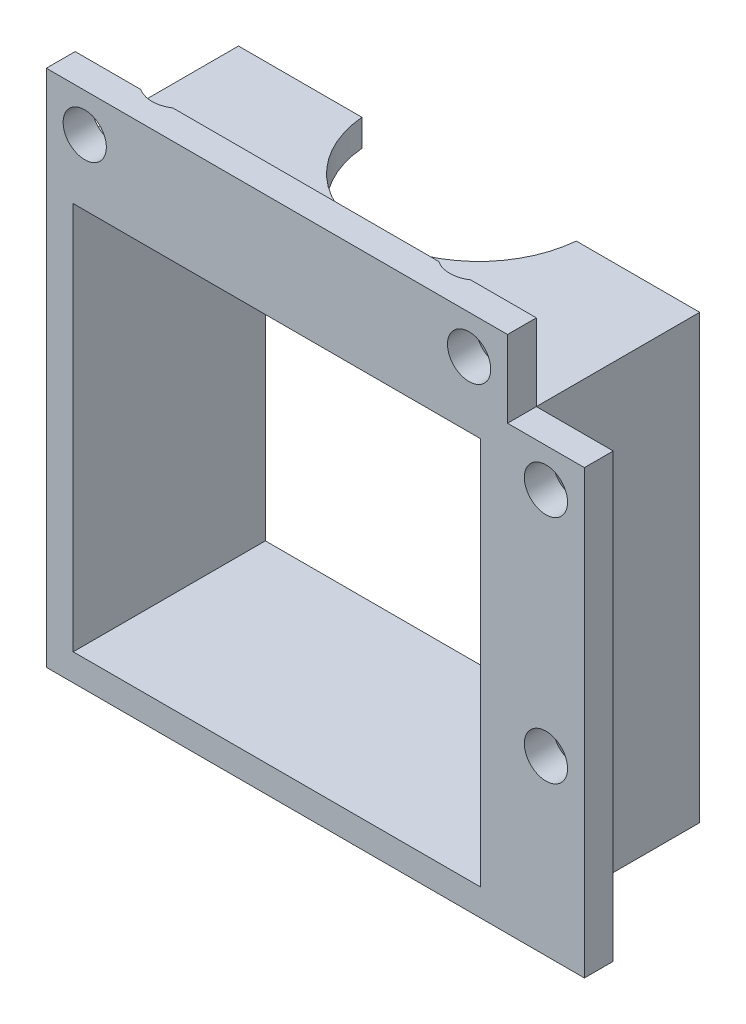
ISO-10303-21;
HEADER;
FILE_DESCRIPTION(('STEP AP214'),'2;1');
FILE_NAME('part.step','',(''),(''),'','','');
FILE_SCHEMA(('AUTOMOTIVE_DESIGN { 1 0 10303 214 1 1 1 1 }'));
ENDSEC;
DATA;
#1=APPLICATION_CONTEXT('core data for automotive mechanical design processes');
#2=APPLICATION_PROTOCOL_DEFINITION('international standard','automotive_design',2000,#1);
#3=PRODUCT_CONTEXT('',#1,'mechanical');
#4=PRODUCT('Part','Part','',(#3));
#5=PRODUCT_RELATED_PRODUCT_CATEGORY('part','',(#4));
#6=PRODUCT_DEFINITION_FORMATION('','',#4);
#7=PRODUCT_DEFINITION_CONTEXT('part definition',#1,'design');
#8=PRODUCT_DEFINITION('design','',#6,#7);
#9=PRODUCT_DEFINITION_SHAPE('','',#8);
#10=(LENGTH_UNIT() NAMED_UNIT(*) SI_UNIT(.MILLI.,.METRE.));
#11=(NAMED_UNIT(*) PLANE_ANGLE_UNIT() SI_UNIT($,.RADIAN.));
#12=(NAMED_UNIT(*) SI_UNIT($,.STERADIAN.) SOLID_ANGLE_UNIT());
#13=UNCERTAINTY_MEASURE_WITH_UNIT(LENGTH_MEASURE(1.E-05),#10,'distance_accuracy_value','');
#14=(GEOMETRIC_REPRESENTATION_CONTEXT(3) GLOBAL_UNCERTAINTY_ASSIGNED_CONTEXT((#13)) GLOBAL_UNIT_ASSIGNED_CONTEXT((#10,
#11,#12)) REPRESENTATION_CONTEXT('',''));
#15=CARTESIAN_POINT('',(0.,0.,0.));
#16=DIRECTION('',(0.,0.,1.));
#17=DIRECTION('',(1.,0.,0.));
#18=AXIS2_PLACEMENT_3D('',#15,#16,#17);
#19=CARTESIAN_POINT('',(0.,0.,-3.));
#20=DIRECTION('',(0.,0.,1.));
#21=DIRECTION('',(1.,0.,0.));
#22=AXIS2_PLACEMENT_3D('',#19,#20,#21);
#23=PLANE('',#22);
#24=CARTESIAN_POINT('',(15.8932700007655,-22.5,-3.));
#25=DIRECTION('',(0.,0.,1.));
#26=DIRECTION('',(1.,0.,0.));
#27=AXIS2_PLACEMENT_3D('',#24,#25,#26);
#28=CIRCLE('',#27,2.25);
#29=CARTESIAN_POINT('',(18.1432700007655,-22.5,-3.));
#30=VERTEX_POINT('',#29);
#31=EDGE_CURVE('E190',#30,#30,#28,.T.);
#32=ORIENTED_EDGE('',*,*,#31,.T.);
#33=EDGE_LOOP('',(#32));
#34=FACE_BOUND('',#33,.T.);
#35=DIRECTION('',(-1.,0.,0.));
#36=VECTOR('',#35,1.);
#37=CARTESIAN_POINT('',(0.,-26.5,-3.));
#38=LINE('',#37,#36);
#39=CARTESIAN_POINT('',(19.8932700007655,-26.5,-3.));
#40=VERTEX_POINT('',#39);
#41=CARTESIAN_POINT('',(13.0515823959432,-26.5,-3.));
#42=VERTEX_POINT('',#41);
#43=EDGE_CURVE('E189',#40,#42,#38,.T.);
#44=ORIENTED_EDGE('',*,*,#43,.T.);
#45=DIRECTION('',(0.,1.,0.));
#46=VECTOR('',#45,1.);
#47=CARTESIAN_POINT('',(13.0515823959432,-34.9852813742386,-3.));
#48=LINE('',#47,#46);
#49=CARTESIAN_POINT('',(13.0515823959432,-18.5,-3.));
#50=VERTEX_POINT('',#49);
#51=EDGE_CURVE('E11',#42,#50,#48,.T.);
#52=ORIENTED_EDGE('',*,*,#51,.T.);
#53=DIRECTION('',(-1.,0.,0.));
#54=VECTOR('',#53,1.);
#55=CARTESIAN_POINT('',(0.,-18.5,-3.));
#56=LINE('',#55,#54);
#57=CARTESIAN_POINT('',(19.8932700007655,-18.5,-3.));
#58=VERTEX_POINT('',#57);
#59=EDGE_CURVE('E225',#58,#50,#56,.T.);
#60=ORIENTED_EDGE('',*,*,#59,.F.);
#61=DIRECTION('',(0.,-1.,0.));
#62=VECTOR('',#61,1.);
#63=CARTESIAN_POINT('',(19.8932700007655,0.,-3.));
#64=LINE('',#63,#62);
#65=EDGE_CURVE('E187',#58,#40,#64,.T.);
#66=ORIENTED_EDGE('',*,*,#65,.T.);
#67=EDGE_LOOP('',(#44,#52,#60,#66));
#68=FACE_BOUND('',#67,.T.);
#69=ADVANCED_FACE('F37',(#34,#68),#23,.F.);
#70=CARTESIAN_POINT('',(9.7349576055878,-18.5,-3.));
#71=VERTEX_POINT('',#70);
#72=CARTESIAN_POINT('',(-17.9484176040568,-18.5,-3.));
#73=VERTEX_POINT('',#72);
#74=EDGE_CURVE('E229',#71,#73,#56,.T.);
#75=ORIENTED_EDGE('',*,*,#74,.F.);
#76=DIRECTION('',(0.,1.,0.));
#77=VECTOR('',#76,1.);
#78=CARTESIAN_POINT('',(9.7349576055878,-34.9852813742386,-3.));
#79=LINE('',#78,#77);
#80=CARTESIAN_POINT('',(9.7349576055878,-26.5,-3.));
#81=VERTEX_POINT('',#80);
#82=EDGE_CURVE('E45',#71,#81,#79,.F.);
#83=ORIENTED_EDGE('',*,*,#82,.T.);
#84=CARTESIAN_POINT('',(-17.9484176040568,-26.5,-3.));
#85=VERTEX_POINT('',#84);
#86=EDGE_CURVE('E186',#81,#85,#38,.T.);
#87=ORIENTED_EDGE('',*,*,#86,.T.);
#88=DIRECTION('',(0.,1.,0.));
#89=VECTOR('',#88,1.);
#90=CARTESIAN_POINT('',(-17.9484176040568,-34.9852813742386,-3.));
#91=LINE('',#90,#89);
#92=EDGE_CURVE('E168',#85,#73,#91,.T.);
#93=ORIENTED_EDGE('',*,*,#92,.T.);
#94=EDGE_LOOP('',(#75,#83,#87,#93));
#95=FACE_BOUND('',#94,.T.);
#96=ADVANCED_FACE('F346',(#95),#23,.F.);
#97=CARTESIAN_POINT('',(-28.1067299992345,-26.5,-20.));
#98=DIRECTION('',(0.,1.,0.));
#99=DIRECTION('',(0.,0.,1.));
#100=AXIS2_PLACEMENT_3D('',#97,#98,#99);
#101=PLANE('',#100);
#102=DIRECTION('',(-1.,0.,0.));
#103=VECTOR('',#102,1.);
#104=CARTESIAN_POINT('',(0.,-26.5,-3.));
#105=LINE('',#104,#103);
#106=CARTESIAN_POINT('',(27.8932700007655,-26.5,-3.));
#107=VERTEX_POINT('',#106);
#108=EDGE_CURVE('E242',#107,#40,#105,.T.);
#109=ORIENTED_EDGE('',*,*,#108,.T.);
#110=DIRECTION('',(0.,0.,1.));
#111=VECTOR('',#110,1.);
#112=CARTESIAN_POINT('',(19.8932700007655,-26.5,-3.));
#113=LINE('',#112,#111);
#114=CARTESIAN_POINT('',(19.8932700007655,-26.5,0.));
#115=VERTEX_POINT('',#114);
#116=EDGE_CURVE('E214',#40,#115,#113,.T.);
#117=ORIENTED_EDGE('',*,*,#116,.T.);
#118=DIRECTION('',(-1.,0.,0.));
#119=VECTOR('',#118,1.);
#120=CARTESIAN_POINT('',(-28.1067299992345,-26.5,0.));
#121=LINE('',#120,#119);
#122=CARTESIAN_POINT('',(27.8932700007655,-26.5,0.));
#123=VERTEX_POINT('',#122);
#124=EDGE_CURVE('E319',#123,#115,#121,.T.);
#125=ORIENTED_EDGE('',*,*,#124,.F.);
#126=DIRECTION('',(0.,0.,1.));
#127=VECTOR('',#126,1.);
#128=CARTESIAN_POINT('',(27.8932700007655,-26.5,-3.));
#129=LINE('',#128,#127);
#130=EDGE_CURVE('E250',#107,#123,#129,.T.);
#131=ORIENTED_EDGE('',*,*,#130,.F.);
#132=EDGE_LOOP('',(#109,#117,#125,#131));
#133=FACE_BOUND('',#132,.T.);
#134=ADVANCED_FACE('F367',(#133),#101,.T.);
#135=CARTESIAN_POINT('',(-28.1067299992345,-26.5,-20.));
#136=DIRECTION('',(-1.,0.,0.));
#137=DIRECTION('',(0.,0.,1.));
#138=AXIS2_PLACEMENT_3D('',#135,#136,#137);
#139=PLANE('',#138);
#140=DIRECTION('',(0.,-1.,0.));
#141=VECTOR('',#140,1.);
#142=CARTESIAN_POINT('',(-28.1067299992345,-26.5,0.));
#143=LINE('',#142,#141);
#144=CARTESIAN_POINT('',(-28.1067299992345,-18.5,0.));
#145=VERTEX_POINT('',#144);
#146=CARTESIAN_POINT('',(-28.1067299992345,-72.5,0.));
#147=VERTEX_POINT('',#146);
#148=EDGE_CURVE('E308',#145,#147,#143,.T.);
#149=ORIENTED_EDGE('',*,*,#148,.F.);
#150=DIRECTION('',(0.,0.,1.));
#151=VECTOR('',#150,1.);
#152=CARTESIAN_POINT('',(-28.1067299992345,-18.5,-3.));
#153=LINE('',#152,#151);
#154=CARTESIAN_POINT('',(-28.1067299992345,-18.5,-3.));
#155=VERTEX_POINT('',#154);
#156=EDGE_CURVE('E228',#155,#145,#153,.T.);
#157=ORIENTED_EDGE('',*,*,#156,.F.);
#158=DIRECTION('',(0.,-1.,0.));
#159=VECTOR('',#158,1.);
#160=CARTESIAN_POINT('',(-28.1067299992345,0.,-3.));
#161=LINE('',#160,#159);
#162=CARTESIAN_POINT('',(-28.1067299992345,-26.5,-3.));
#163=VERTEX_POINT('',#162);
#164=EDGE_CURVE('E216',#155,#163,#161,.T.);
#165=ORIENTED_EDGE('',*,*,#164,.T.);
#166=DIRECTION('',(0.,0.,1.));
#167=VECTOR('',#166,1.);
#168=CARTESIAN_POINT('',(-28.1067299992345,-26.5,-20.));
#169=LINE('',#168,#167);
#170=CARTESIAN_POINT('',(-28.1067299992345,-26.5,-20.));
#171=VERTEX_POINT('',#170);
#172=EDGE_CURVE('E180',#171,#163,#169,.T.);
#173=ORIENTED_EDGE('',*,*,#172,.F.);
#174=DIRECTION('',(0.,-1.,0.));
#175=VECTOR('',#174,1.);
#176=CARTESIAN_POINT('',(-28.1067299992345,-26.5,-20.));
#177=LINE('',#176,#175);
#178=CARTESIAN_POINT('',(-28.1067299992345,-72.5,-20.));
#179=VERTEX_POINT('',#178);
#180=EDGE_CURVE('E315',#171,#179,#177,.T.);
#181=ORIENTED_EDGE('',*,*,#180,.T.);
#182=DIRECTION('',(0.,0.,1.));
#183=VECTOR('',#182,1.);
#184=CARTESIAN_POINT('',(-28.1067299992345,-72.5,-20.));
#185=LINE('',#184,#183);
#186=EDGE_CURVE('E329',#179,#147,#185,.T.);
#187=ORIENTED_EDGE('',*,*,#186,.T.);
#188=EDGE_LOOP('',(#149,#157,#165,#173,#181,#187));
#189=FACE_BOUND('',#188,.T.);
#190=ADVANCED_FACE('F39',(#189),#139,.T.);
#191=ORIENTED_EDGE('',*,*,#86,.F.);
#192=CARTESIAN_POINT('',(11.3932700007655,-26.5,-5.5));
#193=DIRECTION('',(0.,1.,0.));
#194=DIRECTION('',(0.,0.,1.));
#195=AXIS2_PLACEMENT_3D('',#192,#193,#194);
#196=CIRCLE('',#195,3.);
#197=EDGE_CURVE('E58',#42,#81,#196,.F.);
#198=ORIENTED_EDGE('',*,*,#197,.F.);
#199=ORIENTED_EDGE('',*,*,#43,.F.);
#200=DIRECTION('',(0.,0.,1.));
#201=VECTOR('',#200,1.);
#202=CARTESIAN_POINT('',(19.8932700007655,-26.5,-20.));
#203=LINE('',#202,#201);
#204=CARTESIAN_POINT('',(19.8932700007655,-26.5,-20.));
#205=VERTEX_POINT('',#204);
#206=EDGE_CURVE('E336',#205,#40,#203,.T.);
#207=ORIENTED_EDGE('',*,*,#206,.F.);
#208=DIRECTION('',(-1.,0.,0.));
#209=VECTOR('',#208,1.);
#210=CARTESIAN_POINT('',(-28.1067299992345,-26.5,-20.));
#211=LINE('',#210,#209);
#212=CARTESIAN_POINT('',(7.04853781467297,-26.5,-20.));
#213=VERTEX_POINT('',#212);
#214=EDGE_CURVE('E326',#205,#213,#211,.T.);
#215=ORIENTED_EDGE('',*,*,#214,.T.);
#216=CARTESIAN_POINT('',(-4.1067299992345,-26.5,-21.));
#217=DIRECTION('',(0.,1.,0.));
#218=DIRECTION('',(0.,0.,1.));
#219=AXIS2_PLACEMENT_3D('',#216,#217,#218);
#220=CIRCLE('',#219,11.2);
#221=CARTESIAN_POINT('',(-15.261997813142,-26.5,-20.));
#222=VERTEX_POINT('',#221);
#223=EDGE_CURVE('E277',#222,#213,#220,.T.);
#224=ORIENTED_EDGE('',*,*,#223,.F.);
#225=EDGE_CURVE('E325',#222,#171,#211,.T.);
#226=ORIENTED_EDGE('',*,*,#225,.T.);
#227=ORIENTED_EDGE('',*,*,#172,.T.);
#228=CARTESIAN_POINT('',(-21.2650423944122,-26.5,-3.));
#229=VERTEX_POINT('',#228);
#230=EDGE_CURVE('E177',#229,#163,#38,.T.);
#231=ORIENTED_EDGE('',*,*,#230,.F.);
#232=CARTESIAN_POINT('',(-19.6067299992345,-26.5,-5.5));
#233=DIRECTION('',(0.,1.,0.));
#234=DIRECTION('',(0.,0.,1.));
#235=AXIS2_PLACEMENT_3D('',#232,#233,#234);
#236=CIRCLE('',#235,3.);
#237=EDGE_CURVE('E52',#85,#229,#236,.F.);
#238=ORIENTED_EDGE('',*,*,#237,.F.);
#239=EDGE_LOOP('',(#191,#198,#199,#207,#215,#224,#226,#227,#231,#238));
#240=FACE_BOUND('',#239,.T.);
#241=CARTESIAN_POINT('',(-19.6067299992345,-26.5,-5.5));
#242=DIRECTION('',(0.,1.,0.));
#243=DIRECTION('',(0.,0.,1.));
#244=AXIS2_PLACEMENT_3D('',#241,#242,#243);
#245=CIRCLE('',#244,1.7);
#246=CARTESIAN_POINT('',(-19.6067299992345,-26.5,-3.8));
#247=VERTEX_POINT('',#246);
#248=EDGE_CURVE('E259',#247,#247,#245,.T.);
#249=ORIENTED_EDGE('',*,*,#248,.F.);
#250=EDGE_LOOP('',(#249));
#251=FACE_BOUND('',#250,.T.);
#252=CARTESIAN_POINT('',(11.3932700007655,-26.5,-5.5));
#253=DIRECTION('',(0.,1.,0.));
#254=DIRECTION('',(0.,0.,1.));
#255=AXIS2_PLACEMENT_3D('',#252,#253,#254);
#256=CIRCLE('',#255,1.7);
#257=CARTESIAN_POINT('',(11.3932700007655,-26.5,-3.8));
#258=VERTEX_POINT('',#257);
#259=EDGE_CURVE('E262',#258,#258,#256,.T.);
#260=ORIENTED_EDGE('',*,*,#259,.F.);
#261=EDGE_LOOP('',(#260));
#262=FACE_BOUND('',#261,.T.);
#263=ADVANCED_FACE('F183',(#240,#251,#262),#101,.T.);
#264=CARTESIAN_POINT('',(19.8932700007655,-26.5,-20.));
#265=DIRECTION('',(1.,0.,0.));
#266=DIRECTION('',(0.,1.,0.));
#267=AXIS2_PLACEMENT_3D('',#264,#265,#266);
#268=PLANE('',#267);
#269=DIRECTION('',(0.,1.,0.));
#270=VECTOR('',#269,1.);
#271=CARTESIAN_POINT('',(19.8932700007655,0.,-3.));
#272=LINE('',#271,#270);
#273=CARTESIAN_POINT('',(19.8932700007655,-72.5,-3.));
#274=VERTEX_POINT('',#273);
#275=EDGE_CURVE('E245',#274,#40,#272,.T.);
#276=ORIENTED_EDGE('',*,*,#275,.F.);
#277=DIRECTION('',(0.,0.,1.));
#278=VECTOR('',#277,1.);
#279=CARTESIAN_POINT('',(19.8932700007655,-72.5,-20.));
#280=LINE('',#279,#278);
#281=CARTESIAN_POINT('',(19.8932700007655,-72.5,-20.));
#282=VERTEX_POINT('',#281);
#283=EDGE_CURVE('E339',#282,#274,#280,.T.);
#284=ORIENTED_EDGE('',*,*,#283,.F.);
#285=DIRECTION('',(0.,1.,0.));
#286=VECTOR('',#285,1.);
#287=CARTESIAN_POINT('',(19.8932700007655,-26.5,-20.));
#288=LINE('',#287,#286);
#289=EDGE_CURVE('E322',#282,#205,#288,.T.);
#290=ORIENTED_EDGE('',*,*,#289,.T.);
#291=ORIENTED_EDGE('',*,*,#206,.T.);
#292=EDGE_LOOP('',(#276,#284,#290,#291));
#293=FACE_BOUND('',#292,.T.);
#294=ADVANCED_FACE('F380',(#293),#268,.T.);
#295=CARTESIAN_POINT('',(-28.1067299992345,-72.5,-20.));
#296=DIRECTION('',(0.,-1.,0.));
#297=DIRECTION('',(0.,0.,-1.));
#298=AXIS2_PLACEMENT_3D('',#295,#296,#297);
#299=PLANE('',#298);
#300=DIRECTION('',(1.,0.,0.));
#301=VECTOR('',#300,1.);
#302=CARTESIAN_POINT('',(-28.1067299992345,-72.5,0.));
#303=LINE('',#302,#301);
#304=CARTESIAN_POINT('',(27.8932700007655,-72.5,0.));
#305=VERTEX_POINT('',#304);
#306=EDGE_CURVE('E331',#147,#305,#303,.T.);
#307=ORIENTED_EDGE('',*,*,#306,.F.);
#308=ORIENTED_EDGE('',*,*,#186,.F.);
#309=DIRECTION('',(1.,0.,0.));
#310=VECTOR('',#309,1.);
#311=CARTESIAN_POINT('',(-28.1067299992345,-72.5,-20.));
#312=LINE('',#311,#310);
#313=EDGE_CURVE('E318',#179,#282,#312,.T.);
#314=ORIENTED_EDGE('',*,*,#313,.T.);
#315=ORIENTED_EDGE('',*,*,#283,.T.);
#316=DIRECTION('',(-1.,0.,0.));
#317=VECTOR('',#316,1.);
#318=CARTESIAN_POINT('',(0.,-72.5,-3.));
#319=LINE('',#318,#317);
#320=CARTESIAN_POINT('',(27.8932700007655,-72.5,-3.));
#321=VERTEX_POINT('',#320);
#322=EDGE_CURVE('E248',#321,#274,#319,.T.);
#323=ORIENTED_EDGE('',*,*,#322,.F.);
#324=DIRECTION('',(0.,0.,1.));
#325=VECTOR('',#324,1.);
#326=CARTESIAN_POINT('',(27.8932700007655,-72.5,-3.));
#327=LINE('',#326,#325);
#328=EDGE_CURVE('E256',#321,#305,#327,.T.);
#329=ORIENTED_EDGE('',*,*,#328,.T.);
#330=EDGE_LOOP('',(#307,#308,#314,#315,#323,#329));
#331=FACE_BOUND('',#330,.T.);
#332=ADVANCED_FACE('F383',(#331),#299,.T.);
#333=CARTESIAN_POINT('',(0.,0.,-20.));
#334=DIRECTION('',(0.,0.,1.));
#335=DIRECTION('',(1.,0.,0.));
#336=AXIS2_PLACEMENT_3D('',#333,#334,#335);
#337=PLANE('',#336);
#338=DIRECTION('',(-1.,0.,0.));
#339=VECTOR('',#338,1.);
#340=CARTESIAN_POINT('',(-25.3067299992345,-29.3,-20.));
#341=LINE('',#340,#339);
#342=CARTESIAN_POINT('',(17.0932700007655,-29.3,-20.));
#343=VERTEX_POINT('',#342);
#344=CARTESIAN_POINT('',(7.04853781467297,-29.3,-20.));
#345=VERTEX_POINT('',#344);
#346=EDGE_CURVE('E293',#343,#345,#341,.T.);
#347=ORIENTED_EDGE('',*,*,#346,.T.);
#348=DIRECTION('',(0.,1.,0.));
#349=VECTOR('',#348,1.);
#350=CARTESIAN_POINT('',(7.04853781467297,-72.501,-20.));
#351=LINE('',#350,#349);
#352=EDGE_CURVE('E275',#213,#345,#351,.F.);
#353=ORIENTED_EDGE('',*,*,#352,.F.);
#354=ORIENTED_EDGE('',*,*,#214,.F.);
#355=ORIENTED_EDGE('',*,*,#289,.F.);
#356=ORIENTED_EDGE('',*,*,#313,.F.);
#357=ORIENTED_EDGE('',*,*,#180,.F.);
#358=ORIENTED_EDGE('',*,*,#225,.F.);
#359=DIRECTION('',(0.,1.,0.));
#360=VECTOR('',#359,1.);
#361=CARTESIAN_POINT('',(-15.261997813142,-72.501,-20.));
#362=LINE('',#361,#360);
#363=CARTESIAN_POINT('',(-15.261997813142,-29.3,-20.));
#364=VERTEX_POINT('',#363);
#365=EDGE_CURVE('E269',#364,#222,#362,.T.);
#366=ORIENTED_EDGE('',*,*,#365,.F.);
#367=CARTESIAN_POINT('',(-25.3067299992345,-29.3,-20.));
#368=VERTEX_POINT('',#367);
#369=EDGE_CURVE('E292',#364,#368,#341,.T.);
#370=ORIENTED_EDGE('',*,*,#369,.T.);
#371=DIRECTION('',(0.,-1.,0.));
#372=VECTOR('',#371,1.);
#373=CARTESIAN_POINT('',(-25.3067299992345,-29.3,-20.));
#374=LINE('',#373,#372);
#375=CARTESIAN_POINT('',(-25.3067299992345,-69.7,-20.));
#376=VERTEX_POINT('',#375);
#377=EDGE_CURVE('E282',#368,#376,#374,.T.);
#378=ORIENTED_EDGE('',*,*,#377,.T.);
#379=DIRECTION('',(1.,0.,0.));
#380=VECTOR('',#379,1.);
#381=CARTESIAN_POINT('',(-25.3067299992345,-69.7,-20.));
#382=LINE('',#381,#380);
#383=CARTESIAN_POINT('',(17.0932700007655,-69.7,-20.));
#384=VERTEX_POINT('',#383);
#385=EDGE_CURVE('E285',#376,#384,#382,.T.);
#386=ORIENTED_EDGE('',*,*,#385,.T.);
#387=DIRECTION('',(0.,1.,0.));
#388=VECTOR('',#387,1.);
#389=CARTESIAN_POINT('',(17.0932700007655,-29.3,-20.));
#390=LINE('',#389,#388);
#391=EDGE_CURVE('E289',#384,#343,#390,.T.);
#392=ORIENTED_EDGE('',*,*,#391,.T.);
#393=EDGE_LOOP('',(#347,#353,#354,#355,#356,#357,#358,#366,#370,#378,#386,#392));
#394=FACE_BOUND('',#393,.T.);
#395=ADVANCED_FACE('F387',(#394),#337,.F.);
#396=CARTESIAN_POINT('',(0.,0.,0.));
#397=DIRECTION('',(0.,0.,1.));
#398=DIRECTION('',(1.,0.,0.));
#399=AXIS2_PLACEMENT_3D('',#396,#397,#398);
#400=PLANE('',#399);
#401=DIRECTION('',(0.,-1.,0.));
#402=VECTOR('',#401,1.);
#403=CARTESIAN_POINT('',(-25.3067299992345,-29.3,0.));
#404=LINE('',#403,#402);
#405=CARTESIAN_POINT('',(-25.3067299992345,-29.3,0.));
#406=VERTEX_POINT('',#405);
#407=CARTESIAN_POINT('',(-25.3067299992345,-69.7,0.));
#408=VERTEX_POINT('',#407);
#409=EDGE_CURVE('E281',#406,#408,#404,.T.);
#410=ORIENTED_EDGE('',*,*,#409,.F.);
#411=DIRECTION('',(-1.,0.,0.));
#412=VECTOR('',#411,1.);
#413=CARTESIAN_POINT('',(-25.3067299992345,-29.3,0.));
#414=LINE('',#413,#412);
#415=CARTESIAN_POINT('',(17.0932700007655,-29.3,0.));
#416=VERTEX_POINT('',#415);
#417=EDGE_CURVE('E286',#416,#406,#414,.T.);
#418=ORIENTED_EDGE('',*,*,#417,.F.);
#419=DIRECTION('',(0.,1.,0.));
#420=VECTOR('',#419,1.);
#421=CARTESIAN_POINT('',(17.0932700007655,-29.3,0.));
#422=LINE('',#421,#420);
#423=CARTESIAN_POINT('',(17.0932700007655,-69.7,0.));
#424=VERTEX_POINT('',#423);
#425=EDGE_CURVE('E301',#424,#416,#422,.T.);
#426=ORIENTED_EDGE('',*,*,#425,.F.);
#427=DIRECTION('',(1.,0.,0.));
#428=VECTOR('',#427,1.);
#429=CARTESIAN_POINT('',(-25.3067299992345,-69.7,0.));
#430=LINE('',#429,#428);
#431=EDGE_CURVE('E298',#408,#424,#430,.T.);
#432=ORIENTED_EDGE('',*,*,#431,.F.);
#433=EDGE_LOOP('',(#410,#418,#426,#432));
#434=FACE_BOUND('',#433,.T.);
#435=ORIENTED_EDGE('',*,*,#148,.T.);
#436=ORIENTED_EDGE('',*,*,#306,.T.);
#437=DIRECTION('',(0.,1.,0.));
#438=VECTOR('',#437,1.);
#439=CARTESIAN_POINT('',(27.8932700007655,0.,0.));
#440=LINE('',#439,#438);
#441=EDGE_CURVE('E236',#305,#123,#440,.T.);
#442=ORIENTED_EDGE('',*,*,#441,.T.);
#443=ORIENTED_EDGE('',*,*,#124,.T.);
#444=DIRECTION('',(0.,-1.,0.));
#445=VECTOR('',#444,1.);
#446=CARTESIAN_POINT('',(19.8932700007655,0.,0.));
#447=LINE('',#446,#445);
#448=CARTESIAN_POINT('',(19.8932700007655,-18.5,0.));
#449=VERTEX_POINT('',#448);
#450=EDGE_CURVE('E208',#449,#115,#447,.T.);
#451=ORIENTED_EDGE('',*,*,#450,.F.);
#452=DIRECTION('',(-1.,0.,0.));
#453=VECTOR('',#452,1.);
#454=CARTESIAN_POINT('',(0.,-18.5,0.));
#455=LINE('',#454,#453);
#456=EDGE_CURVE('E194',#449,#145,#455,.T.);
#457=ORIENTED_EDGE('',*,*,#456,.T.);
#458=EDGE_LOOP('',(#435,#436,#442,#443,#451,#457));
#459=FACE_BOUND('',#458,.T.);
#460=CARTESIAN_POINT('',(23.8932700007655,-30.5,0.));
#461=DIRECTION('',(0.,0.,1.));
#462=DIRECTION('',(1.,0.,0.));
#463=AXIS2_PLACEMENT_3D('',#460,#461,#462);
#464=CIRCLE('',#463,2.25000000000001);
#465=CARTESIAN_POINT('',(26.1432700007655,-30.5,0.));
#466=VERTEX_POINT('',#465);
#467=EDGE_CURVE('E197',#466,#466,#464,.T.);
#468=ORIENTED_EDGE('',*,*,#467,.F.);
#469=EDGE_LOOP('',(#468));
#470=FACE_BOUND('',#469,.T.);
#471=CARTESIAN_POINT('',(23.8932700007655,-54.5,0.));
#472=DIRECTION('',(0.,0.,1.));
#473=DIRECTION('',(1.,0.,0.));
#474=AXIS2_PLACEMENT_3D('',#471,#472,#473);
#475=CIRCLE('',#474,2.25);
#476=CARTESIAN_POINT('',(26.1432700007655,-54.5,0.));
#477=VERTEX_POINT('',#476);
#478=EDGE_CURVE('E204',#477,#477,#475,.T.);
#479=ORIENTED_EDGE('',*,*,#478,.F.);
#480=EDGE_LOOP('',(#479));
#481=FACE_BOUND('',#480,.T.);
#482=CARTESIAN_POINT('',(-24.1067299992345,-22.5,0.));
#483=DIRECTION('',(0.,0.,1.));
#484=DIRECTION('',(1.,0.,0.));
#485=AXIS2_PLACEMENT_3D('',#482,#483,#484);
#486=CIRCLE('',#485,2.25000000000001);
#487=CARTESIAN_POINT('',(-21.8567299992345,-22.5,0.));
#488=VERTEX_POINT('',#487);
#489=EDGE_CURVE('E213',#488,#488,#486,.T.);
#490=ORIENTED_EDGE('',*,*,#489,.F.);
#491=EDGE_LOOP('',(#490));
#492=FACE_BOUND('',#491,.T.);
#493=CARTESIAN_POINT('',(15.8932700007655,-22.5,0.));
#494=DIRECTION('',(0.,0.,1.));
#495=DIRECTION('',(1.,0.,0.));
#496=AXIS2_PLACEMENT_3D('',#493,#494,#495);
#497=CIRCLE('',#496,2.25);
#498=CARTESIAN_POINT('',(18.1432700007655,-22.5,0.));
#499=VERTEX_POINT('',#498);
#500=EDGE_CURVE('E210',#499,#499,#497,.T.);
#501=ORIENTED_EDGE('',*,*,#500,.F.);
#502=EDGE_LOOP('',(#501));
#503=FACE_BOUND('',#502,.T.);
#504=ADVANCED_FACE('F369',(#434,#459,#470,#481,#492,#503),#400,.T.);
#505=CARTESIAN_POINT('',(-25.3067299992345,-29.3,-20.));
#506=DIRECTION('',(-1.,0.,0.));
#507=DIRECTION('',(0.,0.,1.));
#508=AXIS2_PLACEMENT_3D('',#505,#506,#507);
#509=PLANE('',#508);
#510=ORIENTED_EDGE('',*,*,#409,.T.);
#511=DIRECTION('',(0.,0.,1.));
#512=VECTOR('',#511,1.);
#513=CARTESIAN_POINT('',(-25.3067299992345,-69.7,-20.));
#514=LINE('',#513,#512);
#515=EDGE_CURVE('E296',#376,#408,#514,.T.);
#516=ORIENTED_EDGE('',*,*,#515,.F.);
#517=ORIENTED_EDGE('',*,*,#377,.F.);
#518=DIRECTION('',(0.,0.,1.));
#519=VECTOR('',#518,1.);
#520=CARTESIAN_POINT('',(-25.3067299992345,-29.3,-20.));
#521=LINE('',#520,#519);
#522=EDGE_CURVE('E306',#368,#406,#521,.T.);
#523=ORIENTED_EDGE('',*,*,#522,.T.);
#524=EDGE_LOOP('',(#510,#516,#517,#523));
#525=FACE_BOUND('',#524,.T.);
#526=ADVANCED_FACE('F519',(#525),#509,.F.);
#527=CARTESIAN_POINT('',(-25.3067299992345,-29.3,-20.));
#528=DIRECTION('',(0.,1.,0.));
#529=DIRECTION('',(0.,0.,1.));
#530=AXIS2_PLACEMENT_3D('',#527,#528,#529);
#531=PLANE('',#530);
#532=CARTESIAN_POINT('',(11.3932700007655,-29.3,-5.5));
#533=DIRECTION('',(0.,1.,0.));
#534=DIRECTION('',(0.,0.,1.));
#535=AXIS2_PLACEMENT_3D('',#532,#533,#534);
#536=CIRCLE('',#535,1.7);
#537=CARTESIAN_POINT('',(11.3932700007655,-29.3,-3.8));
#538=VERTEX_POINT('',#537);
#539=EDGE_CURVE('E265',#538,#538,#536,.F.);
#540=ORIENTED_EDGE('',*,*,#539,.F.);
#541=EDGE_LOOP('',(#540));
#542=FACE_BOUND('',#541,.T.);
#543=CARTESIAN_POINT('',(-19.6067299992345,-29.3,-5.5));
#544=DIRECTION('',(0.,1.,0.));
#545=DIRECTION('',(0.,0.,1.));
#546=AXIS2_PLACEMENT_3D('',#543,#544,#545);
#547=CIRCLE('',#546,1.7);
#548=CARTESIAN_POINT('',(-19.6067299992345,-29.3,-3.8));
#549=VERTEX_POINT('',#548);
#550=EDGE_CURVE('E266',#549,#549,#547,.F.);
#551=ORIENTED_EDGE('',*,*,#550,.F.);
#552=EDGE_LOOP('',(#551));
#553=FACE_BOUND('',#552,.T.);
#554=ORIENTED_EDGE('',*,*,#369,.F.);
#555=CARTESIAN_POINT('',(-4.1067299992345,-29.3,-21.));
#556=DIRECTION('',(0.,1.,0.));
#557=DIRECTION('',(0.,0.,1.));
#558=AXIS2_PLACEMENT_3D('',#555,#556,#557);
#559=CIRCLE('',#558,11.2);
#560=EDGE_CURVE('E279',#345,#364,#559,.F.);
#561=ORIENTED_EDGE('',*,*,#560,.F.);
#562=ORIENTED_EDGE('',*,*,#346,.F.);
#563=DIRECTION('',(0.,0.,1.));
#564=VECTOR('',#563,1.);
#565=CARTESIAN_POINT('',(17.0932700007655,-29.3,-20.));
#566=LINE('',#565,#564);
#567=EDGE_CURVE('E309',#343,#416,#566,.T.);
#568=ORIENTED_EDGE('',*,*,#567,.T.);
#569=ORIENTED_EDGE('',*,*,#417,.T.);
#570=ORIENTED_EDGE('',*,*,#522,.F.);
#571=EDGE_LOOP('',(#554,#561,#562,#568,#569,#570));
#572=FACE_BOUND('',#571,.T.);
#573=ADVANCED_FACE('F582',(#542,#553,#572),#531,.F.);
#574=CARTESIAN_POINT('',(17.0932700007655,-29.3,-20.));
#575=DIRECTION('',(1.,0.,0.));
#576=DIRECTION('',(0.,0.,-1.));
#577=AXIS2_PLACEMENT_3D('',#574,#575,#576);
#578=PLANE('',#577);
#579=ORIENTED_EDGE('',*,*,#425,.T.);
#580=ORIENTED_EDGE('',*,*,#567,.F.);
#581=ORIENTED_EDGE('',*,*,#391,.F.);
#582=DIRECTION('',(0.,0.,1.));
#583=VECTOR('',#582,1.);
#584=CARTESIAN_POINT('',(17.0932700007655,-69.7,-20.));
#585=LINE('',#584,#583);
#586=EDGE_CURVE('E311',#384,#424,#585,.T.);
#587=ORIENTED_EDGE('',*,*,#586,.T.);
#588=EDGE_LOOP('',(#579,#580,#581,#587));
#589=FACE_BOUND('',#588,.T.);
#590=ADVANCED_FACE('F587',(#589),#578,.F.);
#591=CARTESIAN_POINT('',(-25.3067299992345,-69.7,-20.));
#592=DIRECTION('',(0.,-1.,0.));
#593=DIRECTION('',(0.,0.,-1.));
#594=AXIS2_PLACEMENT_3D('',#591,#592,#593);
#595=PLANE('',#594);
#596=ORIENTED_EDGE('',*,*,#431,.T.);
#597=ORIENTED_EDGE('',*,*,#586,.F.);
#598=ORIENTED_EDGE('',*,*,#385,.F.);
#599=ORIENTED_EDGE('',*,*,#515,.T.);
#600=EDGE_LOOP('',(#596,#597,#598,#599));
#601=FACE_BOUND('',#600,.T.);
#602=ADVANCED_FACE('F598',(#601),#595,.F.);
#603=CARTESIAN_POINT('',(-4.1067299992345,-72.501,-21.));
#604=DIRECTION('',(0.,1.,0.));
#605=DIRECTION('',(0.,0.,1.));
#606=AXIS2_PLACEMENT_3D('',#603,#604,#605);
#607=CYLINDRICAL_SURFACE('',#606,11.2);
#608=ORIENTED_EDGE('',*,*,#352,.T.);
#609=ORIENTED_EDGE('',*,*,#560,.T.);
#610=ORIENTED_EDGE('',*,*,#365,.T.);
#611=ORIENTED_EDGE('',*,*,#223,.T.);
#612=EDGE_LOOP('',(#608,#609,#610,#611));
#613=FACE_BOUND('',#612,.T.);
#614=ADVANCED_FACE('F574',(#613),#607,.F.);
#615=CARTESIAN_POINT('',(-19.6067299992345,-72.501,-5.5));
#616=DIRECTION('',(0.,1.,0.));
#617=DIRECTION('',(0.,0.,1.));
#618=AXIS2_PLACEMENT_3D('',#615,#616,#617);
#619=CYLINDRICAL_SURFACE('',#618,1.7);
#620=ORIENTED_EDGE('',*,*,#248,.T.);
#621=EDGE_LOOP('',(#620));
#622=FACE_BOUND('',#621,.T.);
#623=ORIENTED_EDGE('',*,*,#550,.T.);
#624=EDGE_LOOP('',(#623));
#625=FACE_BOUND('',#624,.T.);
#626=ADVANCED_FACE('F564',(#622,#625),#619,.F.);
#627=CARTESIAN_POINT('',(11.3932700007655,-72.501,-5.5));
#628=DIRECTION('',(0.,1.,0.));
#629=DIRECTION('',(0.,0.,1.));
#630=AXIS2_PLACEMENT_3D('',#627,#628,#629);
#631=CYLINDRICAL_SURFACE('',#630,1.7);
#632=ORIENTED_EDGE('',*,*,#259,.T.);
#633=EDGE_LOOP('',(#632));
#634=FACE_BOUND('',#633,.T.);
#635=ORIENTED_EDGE('',*,*,#539,.T.);
#636=EDGE_LOOP('',(#635));
#637=FACE_BOUND('',#636,.T.);
#638=ADVANCED_FACE('F511',(#634,#637),#631,.F.);
#639=CARTESIAN_POINT('',(27.8932700007655,0.,-3.));
#640=DIRECTION('',(1.,0.,0.));
#641=DIRECTION('',(0.,0.,-1.));
#642=AXIS2_PLACEMENT_3D('',#639,#640,#641);
#643=PLANE('',#642);
#644=ORIENTED_EDGE('',*,*,#441,.F.);
#645=ORIENTED_EDGE('',*,*,#328,.F.);
#646=DIRECTION('',(0.,1.,0.));
#647=VECTOR('',#646,1.);
#648=CARTESIAN_POINT('',(27.8932700007655,0.,-3.));
#649=LINE('',#648,#647);
#650=EDGE_CURVE('E239',#321,#107,#649,.T.);
#651=ORIENTED_EDGE('',*,*,#650,.T.);
#652=ORIENTED_EDGE('',*,*,#130,.T.);
#653=EDGE_LOOP('',(#644,#645,#651,#652));
#654=FACE_BOUND('',#653,.T.);
#655=ADVANCED_FACE('F374',(#654),#643,.T.);
#656=CARTESIAN_POINT('',(23.8932700007655,-54.5,-3.));
#657=DIRECTION('',(0.,0.,1.));
#658=DIRECTION('',(1.,0.,0.));
#659=AXIS2_PLACEMENT_3D('',#656,#657,#658);
#660=CYLINDRICAL_SURFACE('',#659,2.25);
#661=CARTESIAN_POINT('',(23.8932700007655,-54.5,-3.));
#662=DIRECTION('',(0.,0.,1.));
#663=DIRECTION('',(1.,0.,0.));
#664=AXIS2_PLACEMENT_3D('',#661,#662,#663);
#665=CIRCLE('',#664,2.25);
#666=CARTESIAN_POINT('',(26.1432700007655,-54.5,-3.));
#667=VERTEX_POINT('',#666);
#668=EDGE_CURVE('E235',#667,#667,#665,.T.);
#669=ORIENTED_EDGE('',*,*,#668,.F.);
#670=EDGE_LOOP('',(#669));
#671=FACE_BOUND('',#670,.T.);
#672=ORIENTED_EDGE('',*,*,#478,.T.);
#673=EDGE_LOOP('',(#672));
#674=FACE_BOUND('',#673,.T.);
#675=ADVANCED_FACE('F494',(#671,#674),#660,.F.);
#676=CARTESIAN_POINT('',(23.8932700007655,-30.5,-3.));
#677=DIRECTION('',(0.,0.,1.));
#678=DIRECTION('',(1.,0.,0.));
#679=AXIS2_PLACEMENT_3D('',#676,#677,#678);
#680=CYLINDRICAL_SURFACE('',#679,2.25000000000001);
#681=CARTESIAN_POINT('',(23.8932700007655,-30.5,-3.));
#682=DIRECTION('',(0.,0.,1.));
#683=DIRECTION('',(1.,0.,0.));
#684=AXIS2_PLACEMENT_3D('',#681,#682,#683);
#685=CIRCLE('',#684,2.25000000000001);
#686=CARTESIAN_POINT('',(26.1432700007655,-30.5,-3.));
#687=VERTEX_POINT('',#686);
#688=EDGE_CURVE('E232',#687,#687,#685,.T.);
#689=ORIENTED_EDGE('',*,*,#688,.F.);
#690=EDGE_LOOP('',(#689));
#691=FACE_BOUND('',#690,.T.);
#692=ORIENTED_EDGE('',*,*,#467,.T.);
#693=EDGE_LOOP('',(#692));
#694=FACE_BOUND('',#693,.T.);
#695=ADVANCED_FACE('F486',(#691,#694),#680,.F.);
#696=CARTESIAN_POINT('',(0.,0.,-3.));
#697=DIRECTION('',(0.,0.,1.));
#698=DIRECTION('',(1.,0.,0.));
#699=AXIS2_PLACEMENT_3D('',#696,#697,#698);
#700=PLANE('',#699);
#701=ORIENTED_EDGE('',*,*,#688,.T.);
#702=EDGE_LOOP('',(#701));
#703=FACE_BOUND('',#702,.T.);
#704=ORIENTED_EDGE('',*,*,#668,.T.);
#705=EDGE_LOOP('',(#704));
#706=FACE_BOUND('',#705,.T.);
#707=ORIENTED_EDGE('',*,*,#650,.F.);
#708=ORIENTED_EDGE('',*,*,#322,.T.);
#709=ORIENTED_EDGE('',*,*,#275,.T.);
#710=ORIENTED_EDGE('',*,*,#108,.F.);
#711=EDGE_LOOP('',(#707,#708,#709,#710));
#712=FACE_BOUND('',#711,.T.);
#713=ADVANCED_FACE('F378',(#703,#706,#712),#700,.F.);
#714=CARTESIAN_POINT('',(0.,-18.5,-3.));
#715=DIRECTION('',(0.,1.,0.));
#716=DIRECTION('',(0.,0.,1.));
#717=AXIS2_PLACEMENT_3D('',#714,#715,#716);
#718=PLANE('',#717);
#719=CARTESIAN_POINT('',(11.3932700007655,-18.5,-5.5));
#720=DIRECTION('',(0.,1.,0.));
#721=DIRECTION('',(0.,0.,1.));
#722=AXIS2_PLACEMENT_3D('',#719,#720,#721);
#723=CIRCLE('',#722,3.);
#724=EDGE_CURVE('E170',#71,#50,#723,.T.);
#725=ORIENTED_EDGE('',*,*,#724,.F.);
#726=ORIENTED_EDGE('',*,*,#74,.T.);
#727=CARTESIAN_POINT('',(-19.6067299992345,-18.5,-5.5));
#728=DIRECTION('',(0.,1.,0.));
#729=DIRECTION('',(0.,0.,1.));
#730=AXIS2_PLACEMENT_3D('',#727,#728,#729);
#731=CIRCLE('',#730,3.);
#732=CARTESIAN_POINT('',(-21.2650423944122,-18.5,-3.));
#733=VERTEX_POINT('',#732);
#734=EDGE_CURVE('E171',#733,#73,#731,.T.);
#735=ORIENTED_EDGE('',*,*,#734,.F.);
#736=EDGE_CURVE('E179',#733,#155,#56,.T.);
#737=ORIENTED_EDGE('',*,*,#736,.T.);
#738=ORIENTED_EDGE('',*,*,#156,.T.);
#739=ORIENTED_EDGE('',*,*,#456,.F.);
#740=DIRECTION('',(0.,0.,1.));
#741=VECTOR('',#740,1.);
#742=CARTESIAN_POINT('',(19.8932700007655,-18.5,-3.));
#743=LINE('',#742,#741);
#744=EDGE_CURVE('E361',#58,#449,#743,.T.);
#745=ORIENTED_EDGE('',*,*,#744,.F.);
#746=ORIENTED_EDGE('',*,*,#59,.T.);
#747=EDGE_LOOP('',(#725,#726,#735,#737,#738,#739,#745,#746));
#748=FACE_BOUND('',#747,.T.);
#749=ADVANCED_FACE('F352',(#748),#718,.T.);
#750=CARTESIAN_POINT('',(19.8932700007655,0.,-3.));
#751=DIRECTION('',(-1.,0.,0.));
#752=DIRECTION('',(0.,0.,1.));
#753=AXIS2_PLACEMENT_3D('',#750,#751,#752);
#754=PLANE('',#753);
#755=ORIENTED_EDGE('',*,*,#450,.T.);
#756=ORIENTED_EDGE('',*,*,#116,.F.);
#757=ORIENTED_EDGE('',*,*,#65,.F.);
#758=ORIENTED_EDGE('',*,*,#744,.T.);
#759=EDGE_LOOP('',(#755,#756,#757,#758));
#760=FACE_BOUND('',#759,.T.);
#761=ADVANCED_FACE('F365',(#760),#754,.F.);
#762=CARTESIAN_POINT('',(15.8932700007655,-22.5,-3.));
#763=DIRECTION('',(0.,0.,1.));
#764=DIRECTION('',(1.,0.,0.));
#765=AXIS2_PLACEMENT_3D('',#762,#763,#764);
#766=CYLINDRICAL_SURFACE('',#765,2.25);
#767=ORIENTED_EDGE('',*,*,#31,.F.);
#768=EDGE_LOOP('',(#767));
#769=FACE_BOUND('',#768,.T.);
#770=ORIENTED_EDGE('',*,*,#500,.T.);
#771=EDGE_LOOP('',(#770));
#772=FACE_BOUND('',#771,.T.);
#773=ADVANCED_FACE('F406',(#769,#772),#766,.F.);
#774=CARTESIAN_POINT('',(-24.1067299992345,-22.5,-3.));
#775=DIRECTION('',(0.,0.,1.));
#776=DIRECTION('',(1.,0.,0.));
#777=AXIS2_PLACEMENT_3D('',#774,#775,#776);
#778=CYLINDRICAL_SURFACE('',#777,2.25000000000001);
#779=CARTESIAN_POINT('',(-24.1067299992345,-22.5,-3.));
#780=DIRECTION('',(0.,0.,1.));
#781=DIRECTION('',(1.,0.,0.));
#782=AXIS2_PLACEMENT_3D('',#779,#780,#781);
#783=CIRCLE('',#782,2.25000000000001);
#784=CARTESIAN_POINT('',(-21.8567299992345,-22.5,-3.));
#785=VERTEX_POINT('',#784);
#786=EDGE_CURVE('E219',#785,#785,#783,.T.);
#787=ORIENTED_EDGE('',*,*,#786,.F.);
#788=EDGE_LOOP('',(#787));
#789=FACE_BOUND('',#788,.T.);
#790=ORIENTED_EDGE('',*,*,#489,.T.);
#791=EDGE_LOOP('',(#790));
#792=FACE_BOUND('',#791,.T.);
#793=ADVANCED_FACE('F399',(#789,#792),#778,.F.);
#794=ORIENTED_EDGE('',*,*,#786,.T.);
#795=EDGE_LOOP('',(#794));
#796=FACE_BOUND('',#795,.T.);
#797=ORIENTED_EDGE('',*,*,#736,.F.);
#798=DIRECTION('',(0.,1.,0.));
#799=VECTOR('',#798,1.);
#800=CARTESIAN_POINT('',(-21.2650423944122,-34.9852813742386,-3.));
#801=LINE('',#800,#799);
#802=EDGE_CURVE('E165',#733,#229,#801,.F.);
#803=ORIENTED_EDGE('',*,*,#802,.T.);
#804=ORIENTED_EDGE('',*,*,#230,.T.);
#805=ORIENTED_EDGE('',*,*,#164,.F.);
#806=EDGE_LOOP('',(#797,#803,#804,#805));
#807=FACE_BOUND('',#806,.T.);
#808=ADVANCED_FACE('F175',(#796,#807),#23,.F.);
#809=CARTESIAN_POINT('',(-19.6067299992345,-34.9852813742386,-5.5));
#810=DIRECTION('',(0.,1.,0.));
#811=DIRECTION('',(0.,0.,1.));
#812=AXIS2_PLACEMENT_3D('',#809,#810,#811);
#813=CYLINDRICAL_SURFACE('',#812,3.);
#814=ORIENTED_EDGE('',*,*,#237,.T.);
#815=ORIENTED_EDGE('',*,*,#802,.F.);
#816=ORIENTED_EDGE('',*,*,#734,.T.);
#817=ORIENTED_EDGE('',*,*,#92,.F.);
#818=EDGE_LOOP('',(#814,#815,#816,#817));
#819=FACE_BOUND('',#818,.T.);
#820=ADVANCED_FACE('F164',(#819),#813,.F.);
#821=CARTESIAN_POINT('',(11.3932700007655,-34.9852813742386,-5.5));
#822=DIRECTION('',(0.,1.,0.));
#823=DIRECTION('',(0.,0.,1.));
#824=AXIS2_PLACEMENT_3D('',#821,#822,#823);
#825=CYLINDRICAL_SURFACE('',#824,3.);
#826=ORIENTED_EDGE('',*,*,#197,.T.);
#827=ORIENTED_EDGE('',*,*,#82,.F.);
#828=ORIENTED_EDGE('',*,*,#724,.T.);
#829=ORIENTED_EDGE('',*,*,#51,.F.);
#830=EDGE_LOOP('',(#826,#827,#828,#829));
#831=FACE_BOUND('',#830,.T.);
#832=ADVANCED_FACE('F350',(#831),#825,.F.);
#833=CLOSED_SHELL('',(#69,#96,#134,#190,#263,#294,#332,#395,#504,#526,#573,#590,#602,#614,#626,
#638,#655,#675,#695,#713,#749,#761,#773,#793,#808,#820,#832));
#834=MANIFOLD_SOLID_BREP('B2',#833);
#835=ADVANCED_BREP_SHAPE_REPRESENTATION('',(#18,#834),#14);
#836=SHAPE_DEFINITION_REPRESENTATION(#9,#835);
ENDSEC;
END-ISO-10303-21;
